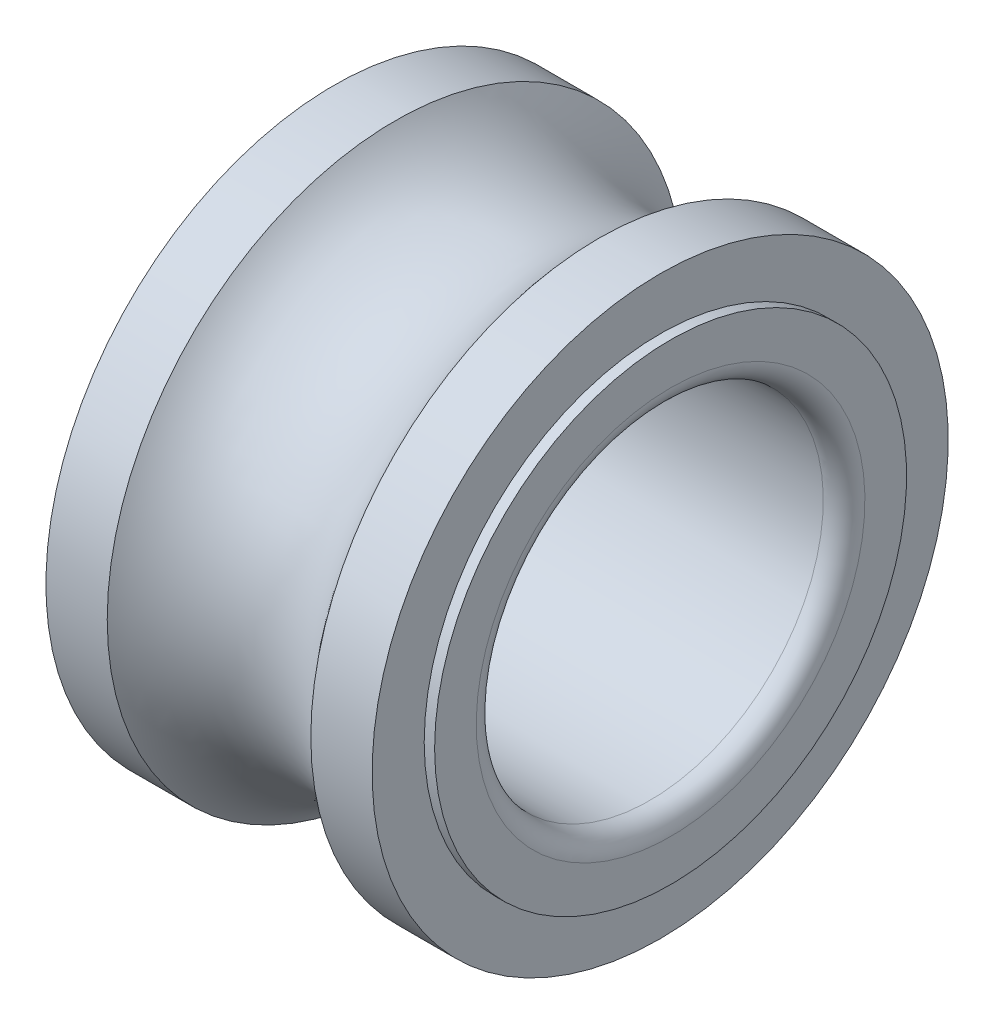
ISO-10303-21;
HEADER;
FILE_DESCRIPTION(('STEP AP214'),'2;1');
FILE_NAME('part.step','',(''),(''),'','','');
FILE_SCHEMA(('AUTOMOTIVE_DESIGN { 1 0 10303 214 1 1 1 1 }'));
ENDSEC;
DATA;
#1=APPLICATION_CONTEXT('core data for automotive mechanical design processes');
#2=APPLICATION_PROTOCOL_DEFINITION('international standard','automotive_design',2000,#1);
#3=PRODUCT_CONTEXT('',#1,'mechanical');
#4=PRODUCT('Part','Part','',(#3));
#5=PRODUCT_RELATED_PRODUCT_CATEGORY('part','',(#4));
#6=PRODUCT_DEFINITION_FORMATION('','',#4);
#7=PRODUCT_DEFINITION_CONTEXT('part definition',#1,'design');
#8=PRODUCT_DEFINITION('design','',#6,#7);
#9=PRODUCT_DEFINITION_SHAPE('','',#8);
#10=(LENGTH_UNIT() NAMED_UNIT(*) SI_UNIT(.MILLI.,.METRE.));
#11=(NAMED_UNIT(*) PLANE_ANGLE_UNIT() SI_UNIT($,.RADIAN.));
#12=(NAMED_UNIT(*) SI_UNIT($,.STERADIAN.) SOLID_ANGLE_UNIT());
#13=UNCERTAINTY_MEASURE_WITH_UNIT(LENGTH_MEASURE(1.E-05),#10,'distance_accuracy_value','');
#14=(GEOMETRIC_REPRESENTATION_CONTEXT(3) GLOBAL_UNCERTAINTY_ASSIGNED_CONTEXT((#13)) GLOBAL_UNIT_ASSIGNED_CONTEXT((#10,
#11,#12)) REPRESENTATION_CONTEXT('',''));
#15=CARTESIAN_POINT('',(0.,0.,0.));
#16=DIRECTION('',(0.,0.,1.));
#17=DIRECTION('',(1.,0.,0.));
#18=AXIS2_PLACEMENT_3D('',#15,#16,#17);
#19=CARTESIAN_POINT('',(-2.2,0.,0.));
#20=DIRECTION('',(1.,0.,0.));
#21=DIRECTION('',(0.,0.,-1.));
#22=AXIS2_PLACEMENT_3D('',#19,#20,#21);
#23=TOROIDAL_SURFACE('',#22,2.8,0.3);
#24=CARTESIAN_POINT('',(-2.2,0.,0.));
#25=DIRECTION('',(1.,0.,0.));
#26=DIRECTION('',(0.,0.,1.));
#27=AXIS2_PLACEMENT_3D('',#24,#25,#26);
#28=CIRCLE('',#27,2.5);
#29=CARTESIAN_POINT('',(-2.2,0.,2.5));
#30=VERTEX_POINT('',#29);
#31=EDGE_CURVE('E10',#30,#30,#28,.T.);
#32=ORIENTED_EDGE('',*,*,#31,.T.);
#33=EDGE_LOOP('',(#32));
#34=FACE_BOUND('',#33,.T.);
#35=CARTESIAN_POINT('',(-2.5,0.,0.));
#36=DIRECTION('',(1.,0.,0.));
#37=DIRECTION('',(0.,-1.,0.));
#38=AXIS2_PLACEMENT_3D('',#35,#36,#37);
#39=CIRCLE('',#38,2.8);
#40=CARTESIAN_POINT('',(-2.5,-2.8,0.));
#41=VERTEX_POINT('',#40);
#42=EDGE_CURVE('E28',#41,#41,#39,.T.);
#43=ORIENTED_EDGE('',*,*,#42,.F.);
#44=EDGE_LOOP('',(#43));
#45=FACE_BOUND('',#44,.T.);
#46=ADVANCED_FACE('F15',(#34,#45),#23,.T.);
#47=CARTESIAN_POINT('',(-2.5,3.475,0.));
#48=DIRECTION('',(-1.,0.,0.));
#49=DIRECTION('',(0.,-1.,0.));
#50=AXIS2_PLACEMENT_3D('',#47,#48,#49);
#51=PLANE('',#50);
#52=CARTESIAN_POINT('',(-2.5,0.,0.));
#53=DIRECTION('',(-1.,0.,0.));
#54=DIRECTION('',(0.,0.,1.));
#55=AXIS2_PLACEMENT_3D('',#52,#53,#54);
#56=CIRCLE('',#55,3.4);
#57=CARTESIAN_POINT('',(-2.5,0.,3.4));
#58=VERTEX_POINT('',#57);
#59=EDGE_CURVE('E23',#58,#58,#56,.T.);
#60=ORIENTED_EDGE('',*,*,#59,.T.);
#61=EDGE_LOOP('',(#60));
#62=FACE_BOUND('',#61,.T.);
#63=ORIENTED_EDGE('',*,*,#42,.T.);
#64=EDGE_LOOP('',(#63));
#65=FACE_BOUND('',#64,.T.);
#66=ADVANCED_FACE('F70',(#62,#65),#51,.T.);
#67=CARTESIAN_POINT('',(-2.925,0.,0.));
#68=DIRECTION('',(1.,0.,0.));
#69=DIRECTION('',(0.,0.,1.));
#70=AXIS2_PLACEMENT_3D('',#67,#68,#69);
#71=CYLINDRICAL_SURFACE('',#70,3.4);
#72=CARTESIAN_POINT('',(-2.35,0.,0.));
#73=DIRECTION('',(1.,0.,0.));
#74=DIRECTION('',(0.,0.,1.));
#75=AXIS2_PLACEMENT_3D('',#72,#73,#74);
#76=CIRCLE('',#75,3.4);
#77=CARTESIAN_POINT('',(-2.35,0.,3.4));
#78=VERTEX_POINT('',#77);
#79=EDGE_CURVE('E32',#78,#78,#76,.T.);
#80=ORIENTED_EDGE('',*,*,#79,.F.);
#81=EDGE_LOOP('',(#80));
#82=FACE_BOUND('',#81,.T.);
#83=ORIENTED_EDGE('',*,*,#59,.F.);
#84=EDGE_LOOP('',(#83));
#85=FACE_BOUND('',#84,.T.);
#86=ADVANCED_FACE('F75',(#82,#85),#71,.T.);
#87=CARTESIAN_POINT('',(-2.35,0.,0.));
#88=DIRECTION('',(1.,0.,0.));
#89=DIRECTION('',(0.,0.,-1.));
#90=AXIS2_PLACEMENT_3D('',#87,#88,#89);
#91=PLANE('',#90);
#92=CARTESIAN_POINT('',(-2.35,0.,0.));
#93=DIRECTION('',(-1.,0.,0.));
#94=DIRECTION('',(0.,-1.,0.));
#95=AXIS2_PLACEMENT_3D('',#92,#93,#94);
#96=CIRCLE('',#95,4.15);
#97=CARTESIAN_POINT('',(-2.35,-4.15,0.));
#98=VERTEX_POINT('',#97);
#99=EDGE_CURVE('E35',#98,#98,#96,.T.);
#100=ORIENTED_EDGE('',*,*,#99,.T.);
#101=EDGE_LOOP('',(#100));
#102=FACE_BOUND('',#101,.T.);
#103=ORIENTED_EDGE('',*,*,#79,.T.);
#104=EDGE_LOOP('',(#103));
#105=FACE_BOUND('',#104,.T.);
#106=ADVANCED_FACE('F82',(#102,#105),#91,.F.);
#107=CARTESIAN_POINT('',(0.,0.,0.));
#108=DIRECTION('',(-1.,0.,0.));
#109=DIRECTION('',(0.,1.,0.));
#110=AXIS2_PLACEMENT_3D('',#107,#108,#109);
#111=CYLINDRICAL_SURFACE('',#110,4.15);
#112=ORIENTED_EDGE('',*,*,#99,.F.);
#113=EDGE_LOOP('',(#112));
#114=FACE_BOUND('',#113,.T.);
#115=CARTESIAN_POINT('',(-1.466666666667,0.,0.));
#116=DIRECTION('',(1.,0.,0.));
#117=DIRECTION('',(0.,0.,-1.));
#118=AXIS2_PLACEMENT_3D('',#115,#116,#117);
#119=CIRCLE('',#118,4.15);
#120=CARTESIAN_POINT('',(-1.466666666667,0.,-4.15));
#121=VERTEX_POINT('',#120);
#122=EDGE_CURVE('E36',#121,#121,#119,.T.);
#123=ORIENTED_EDGE('',*,*,#122,.F.);
#124=EDGE_LOOP('',(#123));
#125=FACE_BOUND('',#124,.T.);
#126=ADVANCED_FACE('F86',(#114,#125),#111,.T.);
#127=CARTESIAN_POINT('',(0.,0.,0.));
#128=DIRECTION('',(1.,0.,0.));
#129=DIRECTION('',(0.,0.,-1.));
#130=AXIS2_PLACEMENT_3D('',#127,#128,#129);
#131=TOROIDAL_SURFACE('',#130,5.25,1.833333333333);
#132=CARTESIAN_POINT('',(1.466666666667,0.,0.));
#133=DIRECTION('',(-1.,0.,0.));
#134=DIRECTION('',(0.,0.,1.));
#135=AXIS2_PLACEMENT_3D('',#132,#133,#134);
#136=CIRCLE('',#135,4.15);
#137=CARTESIAN_POINT('',(1.466666666667,0.,4.15));
#138=VERTEX_POINT('',#137);
#139=EDGE_CURVE('E41',#138,#138,#136,.T.);
#140=ORIENTED_EDGE('',*,*,#139,.T.);
#141=EDGE_LOOP('',(#140));
#142=FACE_BOUND('',#141,.T.);
#143=ORIENTED_EDGE('',*,*,#122,.T.);
#144=EDGE_LOOP('',(#143));
#145=FACE_BOUND('',#144,.T.);
#146=ADVANCED_FACE('F90',(#142,#145),#131,.F.);
#147=CARTESIAN_POINT('',(0.,0.,0.));
#148=DIRECTION('',(-1.,0.,0.));
#149=DIRECTION('',(0.,1.,0.));
#150=AXIS2_PLACEMENT_3D('',#147,#148,#149);
#151=CYLINDRICAL_SURFACE('',#150,4.15);
#152=ORIENTED_EDGE('',*,*,#139,.F.);
#153=EDGE_LOOP('',(#152));
#154=FACE_BOUND('',#153,.T.);
#155=CARTESIAN_POINT('',(2.35,0.,0.));
#156=DIRECTION('',(1.,0.,0.));
#157=DIRECTION('',(0.,1.,0.));
#158=AXIS2_PLACEMENT_3D('',#155,#156,#157);
#159=CIRCLE('',#158,4.15);
#160=CARTESIAN_POINT('',(2.35,4.15,0.));
#161=VERTEX_POINT('',#160);
#162=EDGE_CURVE('E44',#161,#161,#159,.T.);
#163=ORIENTED_EDGE('',*,*,#162,.F.);
#164=EDGE_LOOP('',(#163));
#165=FACE_BOUND('',#164,.T.);
#166=ADVANCED_FACE('F94',(#154,#165),#151,.T.);
#167=CARTESIAN_POINT('',(2.35,0.,0.));
#168=DIRECTION('',(-1.,0.,0.));
#169=DIRECTION('',(0.,0.,1.));
#170=AXIS2_PLACEMENT_3D('',#167,#168,#169);
#171=PLANE('',#170);
#172=ORIENTED_EDGE('',*,*,#162,.T.);
#173=EDGE_LOOP('',(#172));
#174=FACE_BOUND('',#173,.T.);
#175=CARTESIAN_POINT('',(2.35,0.,0.));
#176=DIRECTION('',(-1.,0.,0.));
#177=DIRECTION('',(0.,0.,1.));
#178=AXIS2_PLACEMENT_3D('',#175,#176,#177);
#179=CIRCLE('',#178,3.4);
#180=CARTESIAN_POINT('',(2.35,0.,3.4));
#181=VERTEX_POINT('',#180);
#182=EDGE_CURVE('E47',#181,#181,#179,.T.);
#183=ORIENTED_EDGE('',*,*,#182,.T.);
#184=EDGE_LOOP('',(#183));
#185=FACE_BOUND('',#184,.T.);
#186=ADVANCED_FACE('F98',(#174,#185),#171,.F.);
#187=CARTESIAN_POINT('',(2.925,0.,0.));
#188=DIRECTION('',(-1.,0.,0.));
#189=DIRECTION('',(0.,0.,-1.));
#190=AXIS2_PLACEMENT_3D('',#187,#188,#189);
#191=CYLINDRICAL_SURFACE('',#190,3.4);
#192=ORIENTED_EDGE('',*,*,#182,.F.);
#193=EDGE_LOOP('',(#192));
#194=FACE_BOUND('',#193,.T.);
#195=CARTESIAN_POINT('',(2.5,0.,0.));
#196=DIRECTION('',(1.,0.,0.));
#197=DIRECTION('',(0.,0.,1.));
#198=AXIS2_PLACEMENT_3D('',#195,#196,#197);
#199=CIRCLE('',#198,3.4);
#200=CARTESIAN_POINT('',(2.5,0.,3.4));
#201=VERTEX_POINT('',#200);
#202=EDGE_CURVE('E50',#201,#201,#199,.T.);
#203=ORIENTED_EDGE('',*,*,#202,.F.);
#204=EDGE_LOOP('',(#203));
#205=FACE_BOUND('',#204,.T.);
#206=ADVANCED_FACE('F102',(#194,#205),#191,.T.);
#207=CARTESIAN_POINT('',(2.5,3.475,0.));
#208=DIRECTION('',(1.,0.,0.));
#209=DIRECTION('',(0.,1.,0.));
#210=AXIS2_PLACEMENT_3D('',#207,#208,#209);
#211=PLANE('',#210);
#212=ORIENTED_EDGE('',*,*,#202,.T.);
#213=EDGE_LOOP('',(#212));
#214=FACE_BOUND('',#213,.T.);
#215=CARTESIAN_POINT('',(2.5,0.,0.));
#216=DIRECTION('',(-1.,0.,0.));
#217=DIRECTION('',(0.,1.,0.));
#218=AXIS2_PLACEMENT_3D('',#215,#216,#217);
#219=CIRCLE('',#218,2.8);
#220=CARTESIAN_POINT('',(2.5,2.8,0.));
#221=VERTEX_POINT('',#220);
#222=EDGE_CURVE('E52',#221,#221,#219,.T.);
#223=ORIENTED_EDGE('',*,*,#222,.T.);
#224=EDGE_LOOP('',(#223));
#225=FACE_BOUND('',#224,.T.);
#226=ADVANCED_FACE('F67',(#214,#225),#211,.T.);
#227=CARTESIAN_POINT('',(2.2,0.,0.));
#228=DIRECTION('',(1.,0.,0.));
#229=DIRECTION('',(0.,0.,-1.));
#230=AXIS2_PLACEMENT_3D('',#227,#228,#229);
#231=TOROIDAL_SURFACE('',#230,2.8,0.3);
#232=ORIENTED_EDGE('',*,*,#222,.F.);
#233=EDGE_LOOP('',(#232));
#234=FACE_BOUND('',#233,.T.);
#235=CARTESIAN_POINT('',(2.2,0.,0.));
#236=DIRECTION('',(-1.,0.,0.));
#237=DIRECTION('',(0.,0.,1.));
#238=AXIS2_PLACEMENT_3D('',#235,#236,#237);
#239=CIRCLE('',#238,2.5);
#240=CARTESIAN_POINT('',(2.2,0.,2.5));
#241=VERTEX_POINT('',#240);
#242=EDGE_CURVE('E19',#241,#241,#239,.T.);
#243=ORIENTED_EDGE('',*,*,#242,.T.);
#244=EDGE_LOOP('',(#243));
#245=FACE_BOUND('',#244,.T.);
#246=ADVANCED_FACE('F59',(#234,#245),#231,.T.);
#247=CARTESIAN_POINT('',(0.,0.,0.));
#248=DIRECTION('',(-1.,0.,0.));
#249=DIRECTION('',(0.,1.,0.));
#250=AXIS2_PLACEMENT_3D('',#247,#248,#249);
#251=CYLINDRICAL_SURFACE('',#250,2.5);
#252=ORIENTED_EDGE('',*,*,#31,.F.);
#253=EDGE_LOOP('',(#252));
#254=FACE_BOUND('',#253,.T.);
#255=ORIENTED_EDGE('',*,*,#242,.F.);
#256=EDGE_LOOP('',(#255));
#257=FACE_BOUND('',#256,.T.);
#258=ADVANCED_FACE('F17',(#254,#257),#251,.F.);
#259=CLOSED_SHELL('',(#46,#66,#86,#106,#126,#146,#166,#186,#206,#226,#246,#258));
#260=MANIFOLD_SOLID_BREP('B1',#259);
#261=ADVANCED_BREP_SHAPE_REPRESENTATION('',(#18,#260),#14);
#262=SHAPE_DEFINITION_REPRESENTATION(#9,#261);
ENDSEC;
END-ISO-10303-21;
